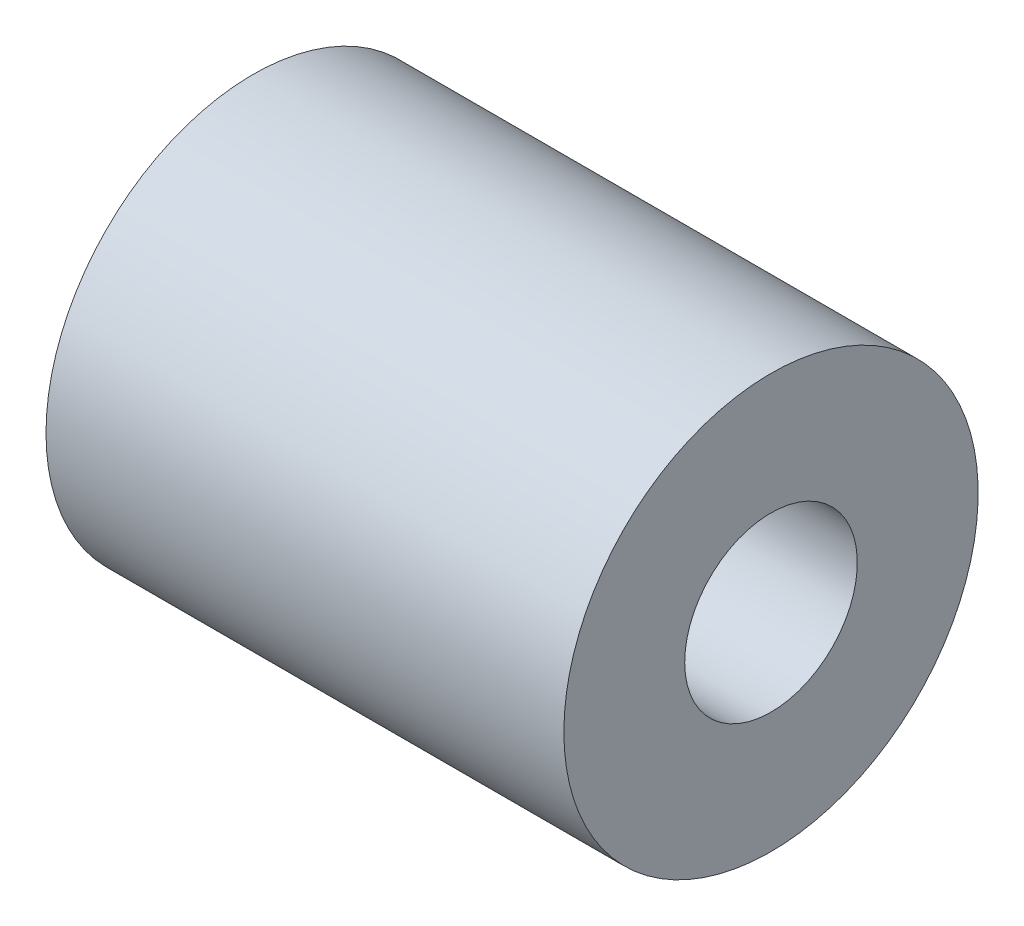
ISO-10303-21;
HEADER;
FILE_DESCRIPTION(('STEP AP214'),'2;1');
FILE_NAME('part.step','',(''),(''),'','','');
FILE_SCHEMA(('AUTOMOTIVE_DESIGN { 1 0 10303 214 1 1 1 1 }'));
ENDSEC;
DATA;
#1=APPLICATION_CONTEXT('core data for automotive mechanical design processes');
#2=APPLICATION_PROTOCOL_DEFINITION('international standard','automotive_design',2000,#1);
#3=PRODUCT_CONTEXT('',#1,'mechanical');
#4=PRODUCT('Part','Part','',(#3));
#5=PRODUCT_RELATED_PRODUCT_CATEGORY('part','',(#4));
#6=PRODUCT_DEFINITION_FORMATION('','',#4);
#7=PRODUCT_DEFINITION_CONTEXT('part definition',#1,'design');
#8=PRODUCT_DEFINITION('design','',#6,#7);
#9=PRODUCT_DEFINITION_SHAPE('','',#8);
#10=(LENGTH_UNIT() NAMED_UNIT(*) SI_UNIT(.MILLI.,.METRE.));
#11=(NAMED_UNIT(*) PLANE_ANGLE_UNIT() SI_UNIT($,.RADIAN.));
#12=(NAMED_UNIT(*) SI_UNIT($,.STERADIAN.) SOLID_ANGLE_UNIT());
#13=UNCERTAINTY_MEASURE_WITH_UNIT(LENGTH_MEASURE(1.E-05),#10,'distance_accuracy_value','');
#14=(GEOMETRIC_REPRESENTATION_CONTEXT(3) GLOBAL_UNCERTAINTY_ASSIGNED_CONTEXT((#13)) GLOBAL_UNIT_ASSIGNED_CONTEXT((#10,
#11,#12)) REPRESENTATION_CONTEXT('',''));
#15=CARTESIAN_POINT('',(0.,0.,0.));
#16=DIRECTION('',(0.,0.,1.));
#17=DIRECTION('',(1.,0.,0.));
#18=AXIS2_PLACEMENT_3D('',#15,#16,#17);
#19=CARTESIAN_POINT('',(-25.0116279069767,0.,0.));
#20=DIRECTION('',(-1.,0.,0.));
#21=DIRECTION('',(0.,0.,1.));
#22=AXIS2_PLACEMENT_3D('',#19,#20,#21);
#23=CYLINDRICAL_SURFACE('',#22,1.5);
#24=CARTESIAN_POINT('',(0.,0.,0.));
#25=DIRECTION('',(-1.,0.,0.));
#26=DIRECTION('',(0.,0.,1.));
#27=AXIS2_PLACEMENT_3D('',#24,#25,#26);
#28=CIRCLE('',#27,1.5);
#29=CARTESIAN_POINT('',(0.,0.,1.5));
#30=VERTEX_POINT('',#29);
#31=EDGE_CURVE('E10',#30,#30,#28,.T.);
#32=ORIENTED_EDGE('',*,*,#31,.F.);
#33=EDGE_LOOP('',(#32));
#34=FACE_BOUND('',#33,.T.);
#35=CARTESIAN_POINT('',(-9.,0.,0.));
#36=DIRECTION('',(-1.,0.,0.));
#37=DIRECTION('',(0.,0.,1.));
#38=AXIS2_PLACEMENT_3D('',#35,#36,#37);
#39=CIRCLE('',#38,1.5);
#40=CARTESIAN_POINT('',(-9.,0.,1.5));
#41=VERTEX_POINT('',#40);
#42=EDGE_CURVE('E49',#41,#41,#39,.T.);
#43=ORIENTED_EDGE('',*,*,#42,.T.);
#44=EDGE_LOOP('',(#43));
#45=FACE_BOUND('',#44,.T.);
#46=ADVANCED_FACE('F35',(#34,#45),#23,.F.);
#47=CARTESIAN_POINT('',(0.,1.5,0.));
#48=DIRECTION('',(-1.,0.,0.));
#49=DIRECTION('',(0.,0.,1.));
#50=AXIS2_PLACEMENT_3D('',#47,#48,#49);
#51=PLANE('',#50);
#52=CARTESIAN_POINT('',(0.,0.,0.));
#53=DIRECTION('',(-1.,0.,0.));
#54=DIRECTION('',(0.,0.,1.));
#55=AXIS2_PLACEMENT_3D('',#52,#53,#54);
#56=CIRCLE('',#55,3.6);
#57=CARTESIAN_POINT('',(0.,0.,3.6));
#58=VERTEX_POINT('',#57);
#59=EDGE_CURVE('E41',#58,#58,#56,.T.);
#60=ORIENTED_EDGE('',*,*,#59,.F.);
#61=EDGE_LOOP('',(#60));
#62=FACE_BOUND('',#61,.T.);
#63=ORIENTED_EDGE('',*,*,#31,.T.);
#64=EDGE_LOOP('',(#63));
#65=FACE_BOUND('',#64,.T.);
#66=ADVANCED_FACE('F64',(#62,#65),#51,.F.);
#67=CARTESIAN_POINT('',(-25.0116279069767,0.,0.));
#68=DIRECTION('',(-1.,0.,0.));
#69=DIRECTION('',(0.,0.,1.));
#70=AXIS2_PLACEMENT_3D('',#67,#68,#69);
#71=CYLINDRICAL_SURFACE('',#70,3.6);
#72=CARTESIAN_POINT('',(-9.,0.,0.));
#73=DIRECTION('',(-1.,0.,0.));
#74=DIRECTION('',(0.,0.,1.));
#75=AXIS2_PLACEMENT_3D('',#72,#73,#74);
#76=CIRCLE('',#75,3.6);
#77=CARTESIAN_POINT('',(-9.,0.,3.6));
#78=VERTEX_POINT('',#77);
#79=EDGE_CURVE('E45',#78,#78,#76,.T.);
#80=ORIENTED_EDGE('',*,*,#79,.F.);
#81=EDGE_LOOP('',(#80));
#82=FACE_BOUND('',#81,.T.);
#83=ORIENTED_EDGE('',*,*,#59,.T.);
#84=EDGE_LOOP('',(#83));
#85=FACE_BOUND('',#84,.T.);
#86=ADVANCED_FACE('F59',(#82,#85),#71,.T.);
#87=CARTESIAN_POINT('',(-9.,3.6,0.));
#88=DIRECTION('',(1.,0.,0.));
#89=DIRECTION('',(0.,0.,-1.));
#90=AXIS2_PLACEMENT_3D('',#87,#88,#89);
#91=PLANE('',#90);
#92=ORIENTED_EDGE('',*,*,#42,.F.);
#93=EDGE_LOOP('',(#92));
#94=FACE_BOUND('',#93,.T.);
#95=ORIENTED_EDGE('',*,*,#79,.T.);
#96=EDGE_LOOP('',(#95));
#97=FACE_BOUND('',#96,.T.);
#98=ADVANCED_FACE('F56',(#94,#97),#91,.F.);
#99=CLOSED_SHELL('',(#46,#66,#86,#98));
#100=MANIFOLD_SOLID_BREP('B2',#99);
#101=ADVANCED_BREP_SHAPE_REPRESENTATION('',(#18,#100),#14);
#102=SHAPE_DEFINITION_REPRESENTATION(#9,#101);
ENDSEC;
END-ISO-10303-21;
